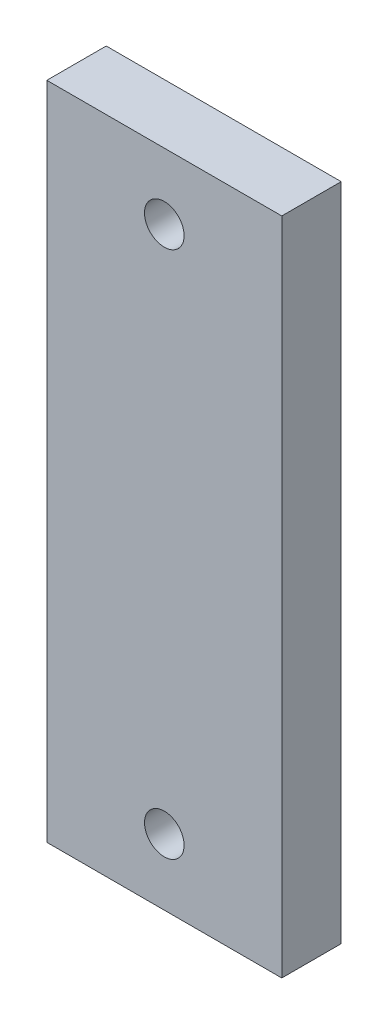
ISO-10303-21;
HEADER;
FILE_DESCRIPTION(('STEP AP214'),'2;1');
FILE_NAME('part.step','',(''),(''),'','','');
FILE_SCHEMA(('AUTOMOTIVE_DESIGN { 1 0 10303 214 1 1 1 1 }'));
ENDSEC;
DATA;
#1=APPLICATION_CONTEXT('core data for automotive mechanical design processes');
#2=APPLICATION_PROTOCOL_DEFINITION('international standard','automotive_design',2000,#1);
#3=PRODUCT_CONTEXT('',#1,'mechanical');
#4=PRODUCT('Part','Part','',(#3));
#5=PRODUCT_RELATED_PRODUCT_CATEGORY('part','',(#4));
#6=PRODUCT_DEFINITION_FORMATION('','',#4);
#7=PRODUCT_DEFINITION_CONTEXT('part definition',#1,'design');
#8=PRODUCT_DEFINITION('design','',#6,#7);
#9=PRODUCT_DEFINITION_SHAPE('','',#8);
#10=(LENGTH_UNIT() NAMED_UNIT(*) SI_UNIT(.MILLI.,.METRE.));
#11=(NAMED_UNIT(*) PLANE_ANGLE_UNIT() SI_UNIT($,.RADIAN.));
#12=(NAMED_UNIT(*) SI_UNIT($,.STERADIAN.) SOLID_ANGLE_UNIT());
#13=UNCERTAINTY_MEASURE_WITH_UNIT(LENGTH_MEASURE(1.E-05),#10,'distance_accuracy_value','');
#14=(GEOMETRIC_REPRESENTATION_CONTEXT(3) GLOBAL_UNCERTAINTY_ASSIGNED_CONTEXT((#13)) GLOBAL_UNIT_ASSIGNED_CONTEXT((#10,
#11,#12)) REPRESENTATION_CONTEXT('',''));
#15=CARTESIAN_POINT('',(0.,0.,0.));
#16=DIRECTION('',(0.,0.,1.));
#17=DIRECTION('',(1.,0.,0.));
#18=AXIS2_PLACEMENT_3D('',#15,#16,#17);
#19=CARTESIAN_POINT('',(0.,0.,4.5));
#20=DIRECTION('',(0.,0.,-1.));
#21=DIRECTION('',(-1.,0.,0.));
#22=AXIS2_PLACEMENT_3D('',#19,#20,#21);
#23=PLANE('',#22);
#24=DIRECTION('',(0.,1.,0.));
#25=VECTOR('',#24,1.);
#26=CARTESIAN_POINT('',(8.9,-25.,4.5));
#27=LINE('',#26,#25);
#28=CARTESIAN_POINT('',(8.9,-25.,4.5));
#29=VERTEX_POINT('',#28);
#30=CARTESIAN_POINT('',(8.9,25.,4.5));
#31=VERTEX_POINT('',#30);
#32=EDGE_CURVE('E98',#29,#31,#27,.T.);
#33=ORIENTED_EDGE('',*,*,#32,.T.);
#34=DIRECTION('',(-1.,0.,0.));
#35=VECTOR('',#34,1.);
#36=CARTESIAN_POINT('',(-8.9,25.,4.5));
#37=LINE('',#36,#35);
#38=CARTESIAN_POINT('',(-8.9,25.,4.5));
#39=VERTEX_POINT('',#38);
#40=EDGE_CURVE('E93',#31,#39,#37,.T.);
#41=ORIENTED_EDGE('',*,*,#40,.T.);
#42=DIRECTION('',(0.,-1.,0.));
#43=VECTOR('',#42,1.);
#44=CARTESIAN_POINT('',(-8.9,-25.,4.5));
#45=LINE('',#44,#43);
#46=CARTESIAN_POINT('',(-8.9,-25.,4.5));
#47=VERTEX_POINT('',#46);
#48=EDGE_CURVE('E96',#39,#47,#45,.T.);
#49=ORIENTED_EDGE('',*,*,#48,.T.);
#50=DIRECTION('',(1.,0.,0.));
#51=VECTOR('',#50,1.);
#52=CARTESIAN_POINT('',(-8.9,-25.,4.5));
#53=LINE('',#52,#51);
#54=EDGE_CURVE('E63',#47,#29,#53,.T.);
#55=ORIENTED_EDGE('',*,*,#54,.T.);
#56=EDGE_LOOP('',(#33,#41,#49,#55));
#57=FACE_BOUND('',#56,.T.);
#58=CARTESIAN_POINT('',(0.,-20.,4.5));
#59=DIRECTION('',(0.,0.,1.));
#60=DIRECTION('',(1.,0.,0.));
#61=AXIS2_PLACEMENT_3D('',#58,#59,#60);
#62=CIRCLE('',#61,1.5);
#63=CARTESIAN_POINT('',(1.5,-20.,4.5));
#64=VERTEX_POINT('',#63);
#65=EDGE_CURVE('E118',#64,#64,#62,.T.);
#66=ORIENTED_EDGE('',*,*,#65,.F.);
#67=EDGE_LOOP('',(#66));
#68=FACE_BOUND('',#67,.T.);
#69=CARTESIAN_POINT('',(0.,20.,4.5));
#70=DIRECTION('',(0.,0.,1.));
#71=DIRECTION('',(1.,0.,0.));
#72=AXIS2_PLACEMENT_3D('',#69,#70,#71);
#73=CIRCLE('',#72,1.5);
#74=CARTESIAN_POINT('',(1.5,20.,4.5));
#75=VERTEX_POINT('',#74);
#76=EDGE_CURVE('E140',#75,#75,#73,.T.);
#77=ORIENTED_EDGE('',*,*,#76,.F.);
#78=EDGE_LOOP('',(#77));
#79=FACE_BOUND('',#78,.T.);
#80=ADVANCED_FACE('F45',(#57,#68,#79),#23,.F.);
#81=CARTESIAN_POINT('',(0.,0.,0.));
#82=DIRECTION('',(0.,0.,-1.));
#83=DIRECTION('',(-1.,0.,0.));
#84=AXIS2_PLACEMENT_3D('',#81,#82,#83);
#85=PLANE('',#84);
#86=CARTESIAN_POINT('',(0.,-20.,0.));
#87=DIRECTION('',(0.,0.,1.));
#88=DIRECTION('',(1.,0.,0.));
#89=AXIS2_PLACEMENT_3D('',#86,#87,#88);
#90=CIRCLE('',#89,1.5);
#91=CARTESIAN_POINT('',(1.5,-20.,0.));
#92=VERTEX_POINT('',#91);
#93=EDGE_CURVE('E136',#92,#92,#90,.T.);
#94=ORIENTED_EDGE('',*,*,#93,.T.);
#95=EDGE_LOOP('',(#94));
#96=FACE_BOUND('',#95,.T.);
#97=DIRECTION('',(0.,1.,0.));
#98=VECTOR('',#97,1.);
#99=CARTESIAN_POINT('',(8.9,-25.,0.));
#100=LINE('',#99,#98);
#101=CARTESIAN_POINT('',(8.9,-25.,0.));
#102=VERTEX_POINT('',#101);
#103=CARTESIAN_POINT('',(8.9,25.,0.));
#104=VERTEX_POINT('',#103);
#105=EDGE_CURVE('E114',#102,#104,#100,.T.);
#106=ORIENTED_EDGE('',*,*,#105,.F.);
#107=DIRECTION('',(1.,0.,0.));
#108=VECTOR('',#107,1.);
#109=CARTESIAN_POINT('',(-8.9,-25.,0.));
#110=LINE('',#109,#108);
#111=CARTESIAN_POINT('',(-8.9,-25.,0.));
#112=VERTEX_POINT('',#111);
#113=EDGE_CURVE('E86',#112,#102,#110,.T.);
#114=ORIENTED_EDGE('',*,*,#113,.F.);
#115=DIRECTION('',(0.,-1.,0.));
#116=VECTOR('',#115,1.);
#117=CARTESIAN_POINT('',(-8.9,-25.,0.));
#118=LINE('',#117,#116);
#119=CARTESIAN_POINT('',(-8.9,25.,0.));
#120=VERTEX_POINT('',#119);
#121=EDGE_CURVE('E80',#120,#112,#118,.T.);
#122=ORIENTED_EDGE('',*,*,#121,.F.);
#123=DIRECTION('',(-1.,0.,0.));
#124=VECTOR('',#123,1.);
#125=CARTESIAN_POINT('',(-8.9,25.,0.));
#126=LINE('',#125,#124);
#127=EDGE_CURVE('E103',#104,#120,#126,.T.);
#128=ORIENTED_EDGE('',*,*,#127,.F.);
#129=EDGE_LOOP('',(#106,#114,#122,#128));
#130=FACE_BOUND('',#129,.T.);
#131=CARTESIAN_POINT('',(0.,20.,0.));
#132=DIRECTION('',(0.,0.,1.));
#133=DIRECTION('',(1.,0.,0.));
#134=AXIS2_PLACEMENT_3D('',#131,#132,#133);
#135=CIRCLE('',#134,1.5);
#136=CARTESIAN_POINT('',(1.5,20.,0.));
#137=VERTEX_POINT('',#136);
#138=EDGE_CURVE('E144',#137,#137,#135,.T.);
#139=ORIENTED_EDGE('',*,*,#138,.T.);
#140=EDGE_LOOP('',(#139));
#141=FACE_BOUND('',#140,.T.);
#142=ADVANCED_FACE('F131',(#96,#130,#141),#85,.T.);
#143=CARTESIAN_POINT('',(8.9,-25.,4.5));
#144=DIRECTION('',(-1.,0.,0.));
#145=DIRECTION('',(0.,0.,1.));
#146=AXIS2_PLACEMENT_3D('',#143,#144,#145);
#147=PLANE('',#146);
#148=ORIENTED_EDGE('',*,*,#105,.T.);
#149=DIRECTION('',(0.,0.,-1.));
#150=VECTOR('',#149,1.);
#151=CARTESIAN_POINT('',(8.9,25.,4.5));
#152=LINE('',#151,#150);
#153=EDGE_CURVE('E11',#31,#104,#152,.T.);
#154=ORIENTED_EDGE('',*,*,#153,.F.);
#155=ORIENTED_EDGE('',*,*,#32,.F.);
#156=DIRECTION('',(0.,0.,-1.));
#157=VECTOR('',#156,1.);
#158=CARTESIAN_POINT('',(8.9,-25.,4.5));
#159=LINE('',#158,#157);
#160=EDGE_CURVE('E110',#29,#102,#159,.T.);
#161=ORIENTED_EDGE('',*,*,#160,.T.);
#162=EDGE_LOOP('',(#148,#154,#155,#161));
#163=FACE_BOUND('',#162,.T.);
#164=ADVANCED_FACE('F47',(#163),#147,.F.);
#165=CARTESIAN_POINT('',(-8.9,25.,4.5));
#166=DIRECTION('',(0.,-1.,0.));
#167=DIRECTION('',(0.,0.,-1.));
#168=AXIS2_PLACEMENT_3D('',#165,#166,#167);
#169=PLANE('',#168);
#170=ORIENTED_EDGE('',*,*,#127,.T.);
#171=DIRECTION('',(0.,0.,-1.));
#172=VECTOR('',#171,1.);
#173=CARTESIAN_POINT('',(-8.9,25.,4.5));
#174=LINE('',#173,#172);
#175=EDGE_CURVE('E55',#39,#120,#174,.T.);
#176=ORIENTED_EDGE('',*,*,#175,.F.);
#177=ORIENTED_EDGE('',*,*,#40,.F.);
#178=ORIENTED_EDGE('',*,*,#153,.T.);
#179=EDGE_LOOP('',(#170,#176,#177,#178));
#180=FACE_BOUND('',#179,.T.);
#181=ADVANCED_FACE('F102',(#180),#169,.F.);
#182=CARTESIAN_POINT('',(-8.9,-25.,4.5));
#183=DIRECTION('',(1.,0.,0.));
#184=DIRECTION('',(0.,0.,-1.));
#185=AXIS2_PLACEMENT_3D('',#182,#183,#184);
#186=PLANE('',#185);
#187=ORIENTED_EDGE('',*,*,#121,.T.);
#188=DIRECTION('',(0.,0.,-1.));
#189=VECTOR('',#188,1.);
#190=CARTESIAN_POINT('',(-8.9,-25.,4.5));
#191=LINE('',#190,#189);
#192=EDGE_CURVE('E105',#47,#112,#191,.T.);
#193=ORIENTED_EDGE('',*,*,#192,.F.);
#194=ORIENTED_EDGE('',*,*,#48,.F.);
#195=ORIENTED_EDGE('',*,*,#175,.T.);
#196=EDGE_LOOP('',(#187,#193,#194,#195));
#197=FACE_BOUND('',#196,.T.);
#198=ADVANCED_FACE('F106',(#197),#186,.F.);
#199=CARTESIAN_POINT('',(-8.9,-25.,4.5));
#200=DIRECTION('',(0.,1.,0.));
#201=DIRECTION('',(0.,0.,1.));
#202=AXIS2_PLACEMENT_3D('',#199,#200,#201);
#203=PLANE('',#202);
#204=ORIENTED_EDGE('',*,*,#113,.T.);
#205=ORIENTED_EDGE('',*,*,#160,.F.);
#206=ORIENTED_EDGE('',*,*,#54,.F.);
#207=ORIENTED_EDGE('',*,*,#192,.T.);
#208=EDGE_LOOP('',(#204,#205,#206,#207));
#209=FACE_BOUND('',#208,.T.);
#210=ADVANCED_FACE('F128',(#209),#203,.F.);
#211=CARTESIAN_POINT('',(0.,-20.,4.5));
#212=DIRECTION('',(0.,0.,-1.));
#213=DIRECTION('',(-1.,0.,0.));
#214=AXIS2_PLACEMENT_3D('',#211,#212,#213);
#215=CYLINDRICAL_SURFACE('',#214,1.5);
#216=ORIENTED_EDGE('',*,*,#65,.T.);
#217=EDGE_LOOP('',(#216));
#218=FACE_BOUND('',#217,.T.);
#219=ORIENTED_EDGE('',*,*,#93,.F.);
#220=EDGE_LOOP('',(#219));
#221=FACE_BOUND('',#220,.T.);
#222=ADVANCED_FACE('F163',(#218,#221),#215,.F.);
#223=CARTESIAN_POINT('',(0.,20.,4.5));
#224=DIRECTION('',(0.,0.,-1.));
#225=DIRECTION('',(-1.,0.,0.));
#226=AXIS2_PLACEMENT_3D('',#223,#224,#225);
#227=CYLINDRICAL_SURFACE('',#226,1.5);
#228=ORIENTED_EDGE('',*,*,#76,.T.);
#229=EDGE_LOOP('',(#228));
#230=FACE_BOUND('',#229,.T.);
#231=ORIENTED_EDGE('',*,*,#138,.F.);
#232=EDGE_LOOP('',(#231));
#233=FACE_BOUND('',#232,.T.);
#234=ADVANCED_FACE('F152',(#230,#233),#227,.F.);
#235=CLOSED_SHELL('',(#80,#142,#164,#181,#198,#210,#222,#234));
#236=MANIFOLD_SOLID_BREP('B2',#235);
#237=ADVANCED_BREP_SHAPE_REPRESENTATION('',(#18,#236),#14);
#238=SHAPE_DEFINITION_REPRESENTATION(#9,#237);
ENDSEC;
END-ISO-10303-21;
